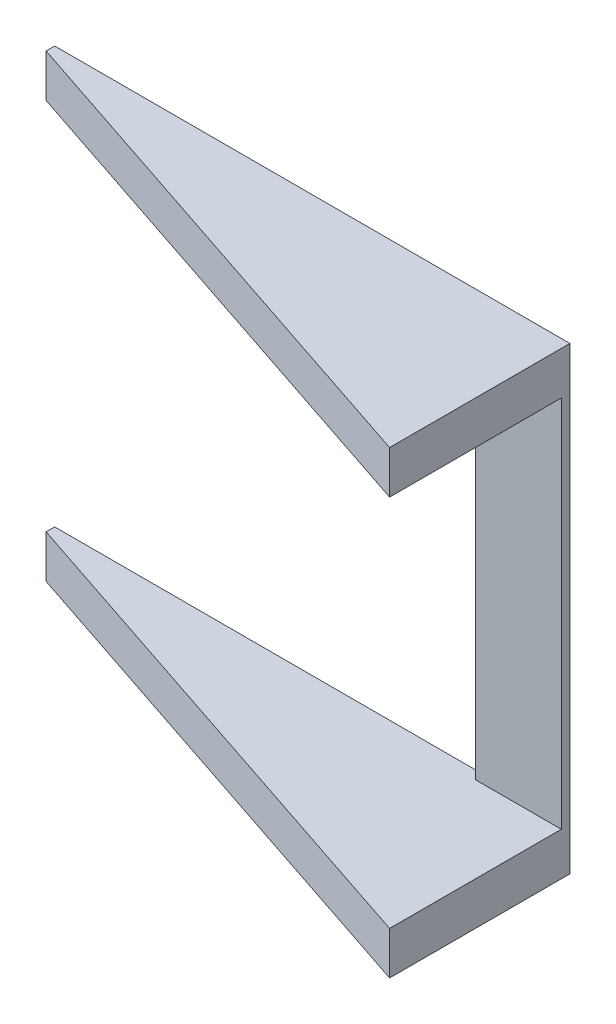
ISO-10303-21;
HEADER;
FILE_DESCRIPTION(('STEP AP214'),'2;1');
FILE_NAME('part.step','',(''),(''),'','','');
FILE_SCHEMA(('AUTOMOTIVE_DESIGN { 1 0 10303 214 1 1 1 1 }'));
ENDSEC;
DATA;
#1=APPLICATION_CONTEXT('core data for automotive mechanical design processes');
#2=APPLICATION_PROTOCOL_DEFINITION('international standard','automotive_design',2000,#1);
#3=PRODUCT_CONTEXT('',#1,'mechanical');
#4=PRODUCT('Part','Part','',(#3));
#5=PRODUCT_RELATED_PRODUCT_CATEGORY('part','',(#4));
#6=PRODUCT_DEFINITION_FORMATION('','',#4);
#7=PRODUCT_DEFINITION_CONTEXT('part definition',#1,'design');
#8=PRODUCT_DEFINITION('design','',#6,#7);
#9=PRODUCT_DEFINITION_SHAPE('','',#8);
#10=(LENGTH_UNIT() NAMED_UNIT(*) SI_UNIT(.MILLI.,.METRE.));
#11=(NAMED_UNIT(*) PLANE_ANGLE_UNIT() SI_UNIT($,.RADIAN.));
#12=(NAMED_UNIT(*) SI_UNIT($,.STERADIAN.) SOLID_ANGLE_UNIT());
#13=UNCERTAINTY_MEASURE_WITH_UNIT(LENGTH_MEASURE(1.E-05),#10,'distance_accuracy_value','');
#14=(GEOMETRIC_REPRESENTATION_CONTEXT(3) GLOBAL_UNCERTAINTY_ASSIGNED_CONTEXT((#13)) GLOBAL_UNIT_ASSIGNED_CONTEXT((#10,
#11,#12)) REPRESENTATION_CONTEXT('',''));
#15=CARTESIAN_POINT('',(0.,0.,0.));
#16=DIRECTION('',(0.,0.,1.));
#17=DIRECTION('',(1.,0.,0.));
#18=AXIS2_PLACEMENT_3D('',#15,#16,#17);
#19=CARTESIAN_POINT('',(0.,0.,2.));
#20=DIRECTION('',(0.,0.,1.));
#21=DIRECTION('',(1.,0.,0.));
#22=AXIS2_PLACEMENT_3D('',#19,#20,#21);
#23=PLANE('',#22);
#24=DIRECTION('',(0.,-1.,0.));
#25=VECTOR('',#24,1.);
#26=CARTESIAN_POINT('',(-53.5418988831112,99.9376489663719,2.));
#27=LINE('',#26,#25);
#28=CARTESIAN_POINT('',(-53.5418988831112,99.9376489663719,2.));
#29=VERTEX_POINT('',#28);
#30=CARTESIAN_POINT('',(-53.5418988831112,12.9376489663719,2.));
#31=VERTEX_POINT('',#30);
#32=EDGE_CURVE('E96',#29,#31,#27,.T.);
#33=ORIENTED_EDGE('',*,*,#32,.T.);
#34=DIRECTION('',(-1.,0.,0.));
#35=VECTOR('',#34,1.);
#36=CARTESIAN_POINT('',(-33.5418988831112,12.9376489663719,2.));
#37=LINE('',#36,#35);
#38=CARTESIAN_POINT('',(-33.5418988831112,12.9376489663719,2.));
#39=VERTEX_POINT('',#38);
#40=EDGE_CURVE('E128',#39,#31,#37,.T.);
#41=ORIENTED_EDGE('',*,*,#40,.F.);
#42=DIRECTION('',(0.,1.,0.));
#43=VECTOR('',#42,1.);
#44=CARTESIAN_POINT('',(-33.5418988831112,109.937648966372,2.));
#45=LINE('',#44,#43);
#46=CARTESIAN_POINT('',(-33.5418988831112,99.9376489663719,2.));
#47=VERTEX_POINT('',#46);
#48=EDGE_CURVE('E48',#39,#47,#45,.T.);
#49=ORIENTED_EDGE('',*,*,#48,.T.);
#50=DIRECTION('',(-1.,0.,0.));
#51=VECTOR('',#50,1.);
#52=CARTESIAN_POINT('',(-153.541898883111,99.9376489663719,2.));
#53=LINE('',#52,#51);
#54=EDGE_CURVE('E191',#47,#29,#53,.T.);
#55=ORIENTED_EDGE('',*,*,#54,.T.);
#56=EDGE_LOOP('',(#33,#41,#49,#55));
#57=FACE_BOUND('',#56,.T.);
#58=ADVANCED_FACE('F33',(#57),#23,.T.);
#59=CARTESIAN_POINT('',(-53.5418988831112,99.9376489663719,2.));
#60=DIRECTION('',(1.,0.,0.));
#61=DIRECTION('',(0.,1.,0.));
#62=AXIS2_PLACEMENT_3D('',#59,#60,#61);
#63=PLANE('',#62);
#64=DIRECTION('',(0.,-1.,0.));
#65=VECTOR('',#64,1.);
#66=CARTESIAN_POINT('',(-53.5418988831112,99.9376489663719,0.));
#67=LINE('',#66,#65);
#68=CARTESIAN_POINT('',(-53.5418988831112,99.9376489663719,0.));
#69=VERTEX_POINT('',#68);
#70=CARTESIAN_POINT('',(-53.5418988831112,12.9376489663719,0.));
#71=VERTEX_POINT('',#70);
#72=EDGE_CURVE('E141',#69,#71,#67,.T.);
#73=ORIENTED_EDGE('',*,*,#72,.T.);
#74=DIRECTION('',(0.,0.,-1.));
#75=VECTOR('',#74,1.);
#76=CARTESIAN_POINT('',(-53.5418988831112,12.9376489663719,2.));
#77=LINE('',#76,#75);
#78=EDGE_CURVE('E11',#31,#71,#77,.T.);
#79=ORIENTED_EDGE('',*,*,#78,.F.);
#80=ORIENTED_EDGE('',*,*,#32,.F.);
#81=DIRECTION('',(0.,0.,-1.));
#82=VECTOR('',#81,1.);
#83=CARTESIAN_POINT('',(-53.5418988831112,99.9376489663719,2.));
#84=LINE('',#83,#82);
#85=EDGE_CURVE('E140',#29,#69,#84,.T.);
#86=ORIENTED_EDGE('',*,*,#85,.T.);
#87=EDGE_LOOP('',(#73,#79,#80,#86));
#88=FACE_BOUND('',#87,.T.);
#89=ADVANCED_FACE('F35',(#88),#63,.F.);
#90=CARTESIAN_POINT('',(-153.541898883111,12.9376489663719,2.));
#91=DIRECTION('',(0.,-1.,0.));
#92=DIRECTION('',(0.,0.,-1.));
#93=AXIS2_PLACEMENT_3D('',#90,#91,#92);
#94=PLANE('',#93);
#95=DIRECTION('',(-1.,0.,0.));
#96=VECTOR('',#95,1.);
#97=CARTESIAN_POINT('',(-153.541898883111,12.9376489663719,0.));
#98=LINE('',#97,#96);
#99=CARTESIAN_POINT('',(-153.541898883111,12.9376489663719,0.));
#100=VERTEX_POINT('',#99);
#101=EDGE_CURVE('E144',#71,#100,#98,.T.);
#102=ORIENTED_EDGE('',*,*,#101,.T.);
#103=DIRECTION('',(0.,0.,-1.));
#104=VECTOR('',#103,1.);
#105=CARTESIAN_POINT('',(-153.541898883111,12.9376489663719,2.));
#106=LINE('',#105,#104);
#107=CARTESIAN_POINT('',(-153.541898883111,12.9376489663719,2.));
#108=VERTEX_POINT('',#107);
#109=EDGE_CURVE('E41',#108,#100,#106,.T.);
#110=ORIENTED_EDGE('',*,*,#109,.F.);
#111=DIRECTION('',(0.948683298050514,0.,0.316227766016838));
#112=VECTOR('',#111,1.);
#113=CARTESIAN_POINT('',(-45.5418988831112,12.9376489663719,38.));
#114=LINE('',#113,#112);
#115=CARTESIAN_POINT('',(-33.5418988831112,12.9376489663719,42.));
#116=VERTEX_POINT('',#115);
#117=EDGE_CURVE('E132',#108,#116,#114,.T.);
#118=ORIENTED_EDGE('',*,*,#117,.T.);
#119=DIRECTION('',(0.,0.,-1.));
#120=VECTOR('',#119,1.);
#121=CARTESIAN_POINT('',(-33.5418988831112,12.9376489663719,2.));
#122=LINE('',#121,#120);
#123=EDGE_CURVE('E178',#116,#39,#122,.T.);
#124=ORIENTED_EDGE('',*,*,#123,.T.);
#125=ORIENTED_EDGE('',*,*,#40,.T.);
#126=ORIENTED_EDGE('',*,*,#78,.T.);
#127=EDGE_LOOP('',(#102,#110,#118,#124,#125,#126));
#128=FACE_BOUND('',#127,.T.);
#129=ADVANCED_FACE('F212',(#128),#94,.F.);
#130=CARTESIAN_POINT('',(-153.541898883111,12.9376489663719,2.));
#131=DIRECTION('',(1.,0.,0.));
#132=DIRECTION('',(0.,0.,-1.));
#133=AXIS2_PLACEMENT_3D('',#130,#131,#132);
#134=PLANE('',#133);
#135=DIRECTION('',(0.,-1.,0.));
#136=VECTOR('',#135,1.);
#137=CARTESIAN_POINT('',(-153.541898883111,12.9376489663719,0.));
#138=LINE('',#137,#136);
#139=CARTESIAN_POINT('',(-153.541898883111,2.93764896637187,0.));
#140=VERTEX_POINT('',#139);
#141=EDGE_CURVE('E114',#100,#140,#138,.T.);
#142=ORIENTED_EDGE('',*,*,#141,.T.);
#143=DIRECTION('',(0.,0.,-1.));
#144=VECTOR('',#143,1.);
#145=CARTESIAN_POINT('',(-153.541898883111,2.93764896637187,2.));
#146=LINE('',#145,#144);
#147=CARTESIAN_POINT('',(-153.541898883111,2.93764896637187,2.));
#148=VERTEX_POINT('',#147);
#149=EDGE_CURVE('E106',#148,#140,#146,.T.);
#150=ORIENTED_EDGE('',*,*,#149,.F.);
#151=DIRECTION('',(0.,-1.,0.));
#152=VECTOR('',#151,1.);
#153=CARTESIAN_POINT('',(-153.541898883111,12.9376489663719,2.));
#154=LINE('',#153,#152);
#155=EDGE_CURVE('E111',#108,#148,#154,.T.);
#156=ORIENTED_EDGE('',*,*,#155,.F.);
#157=ORIENTED_EDGE('',*,*,#109,.T.);
#158=EDGE_LOOP('',(#142,#150,#156,#157));
#159=FACE_BOUND('',#158,.T.);
#160=ADVANCED_FACE('F108',(#159),#134,.F.);
#161=CARTESIAN_POINT('',(-33.5418988831112,2.93764896637188,2.));
#162=DIRECTION('',(0.,1.,0.));
#163=DIRECTION('',(-1.,0.,0.));
#164=AXIS2_PLACEMENT_3D('',#161,#162,#163);
#165=PLANE('',#164);
#166=DIRECTION('',(1.,0.,0.));
#167=VECTOR('',#166,1.);
#168=CARTESIAN_POINT('',(-33.5418988831112,2.93764896637188,0.));
#169=LINE('',#168,#167);
#170=CARTESIAN_POINT('',(-33.5418988831112,2.93764896637188,0.));
#171=VERTEX_POINT('',#170);
#172=EDGE_CURVE('E148',#140,#171,#169,.T.);
#173=ORIENTED_EDGE('',*,*,#172,.T.);
#174=DIRECTION('',(0.,0.,-1.));
#175=VECTOR('',#174,1.);
#176=CARTESIAN_POINT('',(-33.5418988831112,2.93764896637188,2.));
#177=LINE('',#176,#175);
#178=CARTESIAN_POINT('',(-33.5418988831112,2.93764896637188,42.));
#179=VERTEX_POINT('',#178);
#180=EDGE_CURVE('E117',#179,#171,#177,.T.);
#181=ORIENTED_EDGE('',*,*,#180,.F.);
#182=DIRECTION('',(0.948683298050514,0.,0.316227766016838));
#183=VECTOR('',#182,1.);
#184=CARTESIAN_POINT('',(-45.5418988831112,2.93764896637188,38.));
#185=LINE('',#184,#183);
#186=EDGE_CURVE('E121',#148,#179,#185,.T.);
#187=ORIENTED_EDGE('',*,*,#186,.F.);
#188=ORIENTED_EDGE('',*,*,#149,.T.);
#189=EDGE_LOOP('',(#173,#181,#187,#188));
#190=FACE_BOUND('',#189,.T.);
#191=ADVANCED_FACE('F122',(#190),#165,.F.);
#192=CARTESIAN_POINT('',(-33.5418988831112,109.937648966372,2.));
#193=DIRECTION('',(-1.,0.,0.));
#194=DIRECTION('',(0.,-1.,0.));
#195=AXIS2_PLACEMENT_3D('',#192,#193,#194);
#196=PLANE('',#195);
#197=DIRECTION('',(0.,1.,0.));
#198=VECTOR('',#197,1.);
#199=CARTESIAN_POINT('',(-33.5418988831112,109.937648966372,0.));
#200=LINE('',#199,#198);
#201=CARTESIAN_POINT('',(-33.5418988831112,109.937648966372,0.));
#202=VERTEX_POINT('',#201);
#203=EDGE_CURVE('E150',#171,#202,#200,.T.);
#204=ORIENTED_EDGE('',*,*,#203,.T.);
#205=DIRECTION('',(0.,0.,-1.));
#206=VECTOR('',#205,1.);
#207=CARTESIAN_POINT('',(-33.5418988831112,109.937648966372,2.));
#208=LINE('',#207,#206);
#209=CARTESIAN_POINT('',(-33.5418988831112,109.937648966372,42.));
#210=VERTEX_POINT('',#209);
#211=EDGE_CURVE('E162',#210,#202,#208,.T.);
#212=ORIENTED_EDGE('',*,*,#211,.F.);
#213=DIRECTION('',(0.,1.,0.));
#214=VECTOR('',#213,1.);
#215=CARTESIAN_POINT('',(-33.5418988831112,99.9376489663719,42.));
#216=LINE('',#215,#214);
#217=CARTESIAN_POINT('',(-33.5418988831112,99.9376489663719,42.));
#218=VERTEX_POINT('',#217);
#219=EDGE_CURVE('E145',#218,#210,#216,.T.);
#220=ORIENTED_EDGE('',*,*,#219,.F.);
#221=DIRECTION('',(0.,0.,-1.));
#222=VECTOR('',#221,1.);
#223=CARTESIAN_POINT('',(-33.5418988831112,99.9376489663719,2.));
#224=LINE('',#223,#222);
#225=EDGE_CURVE('E189',#218,#47,#224,.T.);
#226=ORIENTED_EDGE('',*,*,#225,.T.);
#227=ORIENTED_EDGE('',*,*,#48,.F.);
#228=ORIENTED_EDGE('',*,*,#123,.F.);
#229=DIRECTION('',(0.,-1.,0.));
#230=VECTOR('',#229,1.);
#231=CARTESIAN_POINT('',(-33.5418988831112,12.9376489663719,42.));
#232=LINE('',#231,#230);
#233=EDGE_CURVE('E175',#116,#179,#232,.T.);
#234=ORIENTED_EDGE('',*,*,#233,.T.);
#235=ORIENTED_EDGE('',*,*,#180,.T.);
#236=EDGE_LOOP('',(#204,#212,#220,#226,#227,#228,#234,#235));
#237=FACE_BOUND('',#236,.T.);
#238=ADVANCED_FACE('F172',(#237),#196,.F.);
#239=CARTESIAN_POINT('',(-153.541898883111,109.937648966372,2.));
#240=DIRECTION('',(0.,-1.,0.));
#241=DIRECTION('',(0.,0.,-1.));
#242=AXIS2_PLACEMENT_3D('',#239,#240,#241);
#243=PLANE('',#242);
#244=DIRECTION('',(-1.,0.,0.));
#245=VECTOR('',#244,1.);
#246=CARTESIAN_POINT('',(-153.541898883111,109.937648966372,0.));
#247=LINE('',#246,#245);
#248=CARTESIAN_POINT('',(-153.541898883111,109.937648966372,0.));
#249=VERTEX_POINT('',#248);
#250=EDGE_CURVE('E152',#202,#249,#247,.T.);
#251=ORIENTED_EDGE('',*,*,#250,.T.);
#252=DIRECTION('',(0.,0.,-1.));
#253=VECTOR('',#252,1.);
#254=CARTESIAN_POINT('',(-153.541898883111,109.937648966372,2.));
#255=LINE('',#254,#253);
#256=CARTESIAN_POINT('',(-153.541898883111,109.937648966372,2.));
#257=VERTEX_POINT('',#256);
#258=EDGE_CURVE('E159',#257,#249,#255,.T.);
#259=ORIENTED_EDGE('',*,*,#258,.F.);
#260=DIRECTION('',(0.948683298050514,0.,0.316227766016838));
#261=VECTOR('',#260,1.);
#262=CARTESIAN_POINT('',(-33.5418988831112,109.937648966372,42.));
#263=LINE('',#262,#261);
#264=EDGE_CURVE('E180',#257,#210,#263,.T.);
#265=ORIENTED_EDGE('',*,*,#264,.T.);
#266=ORIENTED_EDGE('',*,*,#211,.T.);
#267=EDGE_LOOP('',(#251,#259,#265,#266));
#268=FACE_BOUND('',#267,.T.);
#269=ADVANCED_FACE('F203',(#268),#243,.F.);
#270=CARTESIAN_POINT('',(-153.541898883111,109.937648966372,2.));
#271=DIRECTION('',(1.,0.,0.));
#272=DIRECTION('',(0.,0.,-1.));
#273=AXIS2_PLACEMENT_3D('',#270,#271,#272);
#274=PLANE('',#273);
#275=DIRECTION('',(0.,-1.,0.));
#276=VECTOR('',#275,1.);
#277=CARTESIAN_POINT('',(-153.541898883111,109.937648966372,0.));
#278=LINE('',#277,#276);
#279=CARTESIAN_POINT('',(-153.541898883111,99.9376489663719,0.));
#280=VERTEX_POINT('',#279);
#281=EDGE_CURVE('E154',#249,#280,#278,.T.);
#282=ORIENTED_EDGE('',*,*,#281,.T.);
#283=DIRECTION('',(0.,0.,-1.));
#284=VECTOR('',#283,1.);
#285=CARTESIAN_POINT('',(-153.541898883111,99.9376489663719,2.));
#286=LINE('',#285,#284);
#287=CARTESIAN_POINT('',(-153.541898883111,99.9376489663719,2.));
#288=VERTEX_POINT('',#287);
#289=EDGE_CURVE('E57',#288,#280,#286,.T.);
#290=ORIENTED_EDGE('',*,*,#289,.F.);
#291=DIRECTION('',(0.,-1.,0.));
#292=VECTOR('',#291,1.);
#293=CARTESIAN_POINT('',(-153.541898883111,109.937648966372,2.));
#294=LINE('',#293,#292);
#295=EDGE_CURVE('E134',#257,#288,#294,.T.);
#296=ORIENTED_EDGE('',*,*,#295,.F.);
#297=ORIENTED_EDGE('',*,*,#258,.T.);
#298=EDGE_LOOP('',(#282,#290,#296,#297));
#299=FACE_BOUND('',#298,.T.);
#300=ADVANCED_FACE('F205',(#299),#274,.F.);
#301=CARTESIAN_POINT('',(-153.541898883111,99.9376489663719,2.));
#302=DIRECTION('',(0.,1.,0.));
#303=DIRECTION('',(0.,0.,1.));
#304=AXIS2_PLACEMENT_3D('',#301,#302,#303);
#305=PLANE('',#304);
#306=DIRECTION('',(1.,0.,0.));
#307=VECTOR('',#306,1.);
#308=CARTESIAN_POINT('',(-153.541898883111,99.9376489663719,0.));
#309=LINE('',#308,#307);
#310=EDGE_CURVE('E90',#280,#69,#309,.T.);
#311=ORIENTED_EDGE('',*,*,#310,.T.);
#312=ORIENTED_EDGE('',*,*,#85,.F.);
#313=ORIENTED_EDGE('',*,*,#54,.F.);
#314=ORIENTED_EDGE('',*,*,#225,.F.);
#315=DIRECTION('',(0.948683298050514,0.,0.316227766016838));
#316=VECTOR('',#315,1.);
#317=CARTESIAN_POINT('',(-33.5418988831112,99.9376489663719,42.));
#318=LINE('',#317,#316);
#319=EDGE_CURVE('E183',#288,#218,#318,.T.);
#320=ORIENTED_EDGE('',*,*,#319,.F.);
#321=ORIENTED_EDGE('',*,*,#289,.T.);
#322=EDGE_LOOP('',(#311,#312,#313,#314,#320,#321));
#323=FACE_BOUND('',#322,.T.);
#324=ADVANCED_FACE('F206',(#323),#305,.F.);
#325=CARTESIAN_POINT('',(0.,0.,0.));
#326=DIRECTION('',(0.,0.,1.));
#327=DIRECTION('',(1.,0.,0.));
#328=AXIS2_PLACEMENT_3D('',#325,#326,#327);
#329=PLANE('',#328);
#330=ORIENTED_EDGE('',*,*,#72,.F.);
#331=ORIENTED_EDGE('',*,*,#310,.F.);
#332=ORIENTED_EDGE('',*,*,#281,.F.);
#333=ORIENTED_EDGE('',*,*,#250,.F.);
#334=ORIENTED_EDGE('',*,*,#203,.F.);
#335=ORIENTED_EDGE('',*,*,#172,.F.);
#336=ORIENTED_EDGE('',*,*,#141,.F.);
#337=ORIENTED_EDGE('',*,*,#101,.F.);
#338=EDGE_LOOP('',(#330,#331,#332,#333,#334,#335,#336,#337));
#339=FACE_BOUND('',#338,.T.);
#340=ADVANCED_FACE('F168',(#339),#329,.F.);
#341=CARTESIAN_POINT('',(-33.5418988831112,99.9376489663719,42.));
#342=DIRECTION('',(-0.316227766016838,0.,0.948683298050514));
#343=DIRECTION('',(0.948683298050514,0.,0.316227766016838));
#344=AXIS2_PLACEMENT_3D('',#341,#342,#343);
#345=PLANE('',#344);
#346=ORIENTED_EDGE('',*,*,#264,.F.);
#347=ORIENTED_EDGE('',*,*,#295,.T.);
#348=ORIENTED_EDGE('',*,*,#319,.T.);
#349=ORIENTED_EDGE('',*,*,#219,.T.);
#350=EDGE_LOOP('',(#346,#347,#348,#349));
#351=FACE_BOUND('',#350,.T.);
#352=ADVANCED_FACE('F197',(#351),#345,.T.);
#353=CARTESIAN_POINT('',(-45.5418988831112,12.9376489663719,38.));
#354=DIRECTION('',(0.316227766016838,0.,-0.948683298050514));
#355=DIRECTION('',(-0.948683298050514,0.,-0.316227766016838));
#356=AXIS2_PLACEMENT_3D('',#353,#354,#355);
#357=PLANE('',#356);
#358=ORIENTED_EDGE('',*,*,#186,.T.);
#359=ORIENTED_EDGE('',*,*,#233,.F.);
#360=ORIENTED_EDGE('',*,*,#117,.F.);
#361=ORIENTED_EDGE('',*,*,#155,.T.);
#362=EDGE_LOOP('',(#358,#359,#360,#361));
#363=FACE_BOUND('',#362,.T.);
#364=ADVANCED_FACE('F130',(#363),#357,.F.);
#365=CLOSED_SHELL('',(#58,#89,#129,#160,#191,#238,#269,#300,#324,#340,#352,#364));
#366=MANIFOLD_SOLID_BREP('B2',#365);
#367=ADVANCED_BREP_SHAPE_REPRESENTATION('',(#18,#366),#14);
#368=SHAPE_DEFINITION_REPRESENTATION(#9,#367);
ENDSEC;
END-ISO-10303-21;
